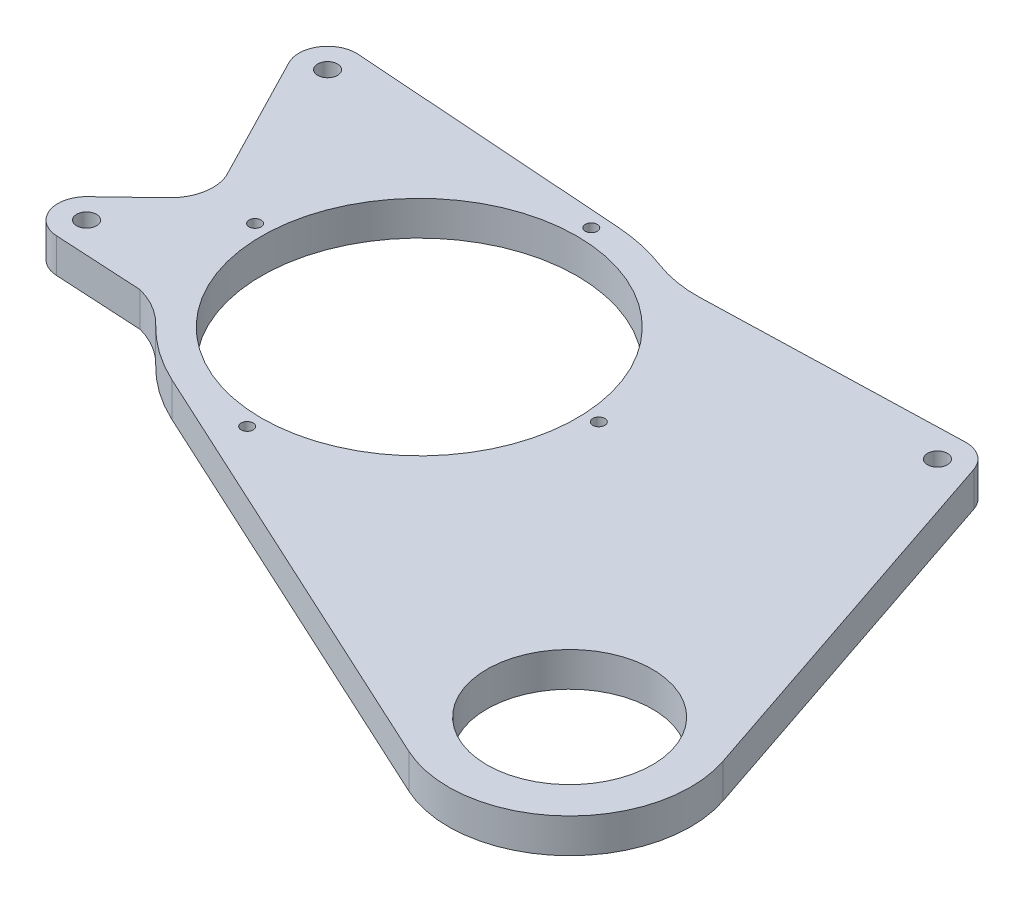
ISO-10303-21;
HEADER;
FILE_DESCRIPTION(('STEP AP214'),'2;1');
FILE_NAME('part.step','',(''),(''),'','','');
FILE_SCHEMA(('AUTOMOTIVE_DESIGN { 1 0 10303 214 1 1 1 1 }'));
ENDSEC;
DATA;
#1=APPLICATION_CONTEXT('core data for automotive mechanical design processes');
#2=APPLICATION_PROTOCOL_DEFINITION('international standard','automotive_design',2000,#1);
#3=PRODUCT_CONTEXT('',#1,'mechanical');
#4=PRODUCT('Part','Part','',(#3));
#5=PRODUCT_RELATED_PRODUCT_CATEGORY('part','',(#4));
#6=PRODUCT_DEFINITION_FORMATION('','',#4);
#7=PRODUCT_DEFINITION_CONTEXT('part definition',#1,'design');
#8=PRODUCT_DEFINITION('design','',#6,#7);
#9=PRODUCT_DEFINITION_SHAPE('','',#8);
#10=(LENGTH_UNIT() NAMED_UNIT(*) SI_UNIT(.MILLI.,.METRE.));
#11=(NAMED_UNIT(*) PLANE_ANGLE_UNIT() SI_UNIT($,.RADIAN.));
#12=(NAMED_UNIT(*) SI_UNIT($,.STERADIAN.) SOLID_ANGLE_UNIT());
#13=UNCERTAINTY_MEASURE_WITH_UNIT(LENGTH_MEASURE(1.E-05),#10,'distance_accuracy_value','');
#14=(GEOMETRIC_REPRESENTATION_CONTEXT(3) GLOBAL_UNCERTAINTY_ASSIGNED_CONTEXT((#13)) GLOBAL_UNIT_ASSIGNED_CONTEXT((#10,
#11,#12)) REPRESENTATION_CONTEXT('',''));
#15=CARTESIAN_POINT('',(0.,0.,0.));
#16=DIRECTION('',(0.,0.,1.));
#17=DIRECTION('',(1.,0.,0.));
#18=AXIS2_PLACEMENT_3D('',#15,#16,#17);
#19=CARTESIAN_POINT('',(-438.15,11.43,160.02));
#20=DIRECTION('',(0.,1.,0.));
#21=DIRECTION('',(0.,0.,1.));
#22=AXIS2_PLACEMENT_3D('',#19,#20,#21);
#23=PLANE('',#22);
#24=CARTESIAN_POINT('',(-575.309999999999,11.43,129.971477371938));
#25=DIRECTION('',(0.,1.,0.));
#26=DIRECTION('',(0.,0.,1.));
#27=AXIS2_PLACEMENT_3D('',#24,#25,#26);
#28=CIRCLE('',#27,2.);
#29=CARTESIAN_POINT('',(-575.309999999999,11.43,131.971477371938));
#30=VERTEX_POINT('',#29);
#31=EDGE_CURVE('E373',#30,#30,#28,.T.);
#32=ORIENTED_EDGE('',*,*,#31,.F.);
#33=EDGE_LOOP('',(#32));
#34=FACE_BOUND('',#33,.T.);
#35=CARTESIAN_POINT('',(-518.217546247164,11.43,70.2574523174055));
#36=DIRECTION('',(0.,1.,0.));
#37=DIRECTION('',(0.,0.,1.));
#38=AXIS2_PLACEMENT_3D('',#35,#36,#37);
#39=CIRCLE('',#38,2.);
#40=CARTESIAN_POINT('',(-518.217546247164,11.43,72.2574523174055));
#41=VERTEX_POINT('',#40);
#42=EDGE_CURVE('E385',#41,#41,#39,.T.);
#43=ORIENTED_EDGE('',*,*,#42,.F.);
#44=EDGE_LOOP('',(#43));
#45=FACE_BOUND('',#44,.T.);
#46=CARTESIAN_POINT('',(-661.36723064215,11.43,97.2747621526214));
#47=DIRECTION('',(0.,1.,0.));
#48=DIRECTION('',(0.,0.,1.));
#49=AXIS2_PLACEMENT_3D('',#46,#47,#48);
#50=CIRCLE('',#49,3.29999999999998);
#51=CARTESIAN_POINT('',(-661.36723064215,11.43,100.574762152621));
#52=VERTEX_POINT('',#51);
#53=EDGE_CURVE('E397',#52,#52,#50,.T.);
#54=ORIENTED_EDGE('',*,*,#53,.F.);
#55=EDGE_LOOP('',(#54));
#56=FACE_BOUND('',#55,.T.);
#57=CARTESIAN_POINT('',(-575.310000000001,11.43,15.6714773719377));
#58=DIRECTION('',(0.,1.,0.));
#59=DIRECTION('',(0.,0.,1.));
#60=AXIS2_PLACEMENT_3D('',#57,#58,#59);
#61=CIRCLE('',#60,2.);
#62=CARTESIAN_POINT('',(-575.310000000001,11.43,17.6714773719377));
#63=VERTEX_POINT('',#62);
#64=EDGE_CURVE('E409',#63,#63,#61,.T.);
#65=ORIENTED_EDGE('',*,*,#64,.F.);
#66=EDGE_LOOP('',(#65));
#67=FACE_BOUND('',#66,.T.);
#68=CARTESIAN_POINT('',(-438.15,11.43,160.02));
#69=DIRECTION('',(0.,1.,0.));
#70=DIRECTION('',(0.,0.,1.));
#71=AXIS2_PLACEMENT_3D('',#68,#69,#70);
#72=CIRCLE('',#71,40.259);
#73=CARTESIAN_POINT('',(-455.030211447492,11.43,196.569220819163));
#74=VERTEX_POINT('',#73);
#75=CARTESIAN_POINT('',(-399.995822112168,11.43,147.172985144259));
#76=VERTEX_POINT('',#75);
#77=EDGE_CURVE('E219',#74,#76,#72,.T.);
#78=ORIENTED_EDGE('',*,*,#77,.T.);
#79=DIRECTION('',(-0.319109139713878,0.,-0.947717973318576));
#80=VECTOR('',#79,1.);
#81=CARTESIAN_POINT('',(-399.995822112168,11.43,147.172985144259));
#82=LINE('',#81,#80);
#83=CARTESIAN_POINT('',(-442.257047487843,11.43,21.6619361692704));
#84=VERTEX_POINT('',#83);
#85=EDGE_CURVE('E127',#76,#84,#82,.T.);
#86=ORIENTED_EDGE('',*,*,#85,.T.);
#87=CARTESIAN_POINT('',(-451.284061183703,11.43,24.701450725045));
#88=DIRECTION('',(0.,1.,0.));
#89=DIRECTION('',(0.,0.,-1.));
#90=AXIS2_PLACEMENT_3D('',#87,#88,#89);
#91=CIRCLE('',#90,9.52499999999995);
#92=CARTESIAN_POINT('',(-451.561292182367,11.43,15.1804860694348));
#93=VERTEX_POINT('',#92);
#94=EDGE_CURVE('E258',#84,#93,#91,.T.);
#95=ORIENTED_EDGE('',*,*,#94,.T.);
#96=DIRECTION('',(-0.999576341796351,0.,0.0291056166577078));
#97=VECTOR('',#96,1.);
#98=CARTESIAN_POINT('',(-451.561292182367,11.43,15.1804860694348));
#99=LINE('',#98,#97);
#100=CARTESIAN_POINT('',(-537.109590398568,11.43,17.6714773719353));
#101=VERTEX_POINT('',#100);
#102=EDGE_CURVE('E277',#93,#101,#99,.T.);
#103=ORIENTED_EDGE('',*,*,#102,.T.);
#104=CARTESIAN_POINT('',(-538.36669905479,11.43,-24.4185739672033));
#105=DIRECTION('',(0.,-1.,0.));
#106=DIRECTION('',(0.,0.,-1.));
#107=AXIS2_PLACEMENT_3D('',#104,#105,#106);
#108=CIRCLE('',#107,42.1088202625635);
#109=CARTESIAN_POINT('',(-553.32169881331,11.43,14.9451241076412));
#110=VERTEX_POINT('',#109);
#111=EDGE_CURVE('E274',#101,#110,#108,.T.);
#112=ORIENTED_EDGE('',*,*,#111,.T.);
#113=CARTESIAN_POINT('',(-575.31,11.43,72.8214773719359));
#114=DIRECTION('',(0.,1.,0.));
#115=DIRECTION('',(0.,0.,-1.));
#116=AXIS2_PLACEMENT_3D('',#113,#114,#115);
#117=CIRCLE('',#116,61.9125);
#118=CARTESIAN_POINT('',(-570.934950003382,11.43,11.0637523994509));
#119=VERTEX_POINT('',#118);
#120=EDGE_CURVE('E276',#110,#119,#117,.T.);
#121=ORIENTED_EDGE('',*,*,#120,.T.);
#122=DIRECTION('',(-0.997500100504502,0.,-0.0706650514293185));
#123=VECTOR('',#122,1.);
#124=CARTESIAN_POINT('',(-663.918846706779,11.43,4.47657327102698));
#125=LINE('',#124,#123);
#126=CARTESIAN_POINT('',(-663.918846706779,11.43,4.4765732710271));
#127=VERTEX_POINT('',#126);
#128=EDGE_CURVE('E279',#119,#127,#125,.T.);
#129=ORIENTED_EDGE('',*,*,#128,.T.);
#130=CARTESIAN_POINT('',(-664.591931321642,11.43,13.9777617283334));
#131=DIRECTION('',(0.,1.,0.));
#132=DIRECTION('',(0.,0.,-1.));
#133=AXIS2_PLACEMENT_3D('',#130,#131,#132);
#134=CIRCLE('',#133,9.52500000000082);
#135=CARTESIAN_POINT('',(-673.057822329129,11.43,18.342886520291));
#136=VERTEX_POINT('',#135);
#137=EDGE_CURVE('E285',#127,#136,#134,.T.);
#138=ORIENTED_EDGE('',*,*,#137,.T.);
#139=DIRECTION('',(0.458280818053406,0.,0.888807454854144));
#140=VECTOR('',#139,1.);
#141=CARTESIAN_POINT('',(-673.057822329129,11.43,18.342886520291));
#142=LINE('',#141,#140);
#143=CARTESIAN_POINT('',(-650.805846426374,11.43,61.499224923482));
#144=VERTEX_POINT('',#143);
#145=EDGE_CURVE('E287',#136,#144,#142,.T.);
#146=ORIENTED_EDGE('',*,*,#145,.T.);
#147=CARTESIAN_POINT('',(-663.980843162533,11.43,66.9216951783142));
#148=DIRECTION('',(0.,-1.,0.));
#149=DIRECTION('',(0.,0.,1.));
#150=AXIS2_PLACEMENT_3D('',#147,#148,#149);
#151=CIRCLE('',#150,14.2472356147552);
#152=CARTESIAN_POINT('',(-654.343117313033,11.43,77.414452828819));
#153=VERTEX_POINT('',#152);
#154=EDGE_CURVE('E289',#144,#153,#151,.T.);
#155=ORIENTED_EDGE('',*,*,#154,.T.);
#156=DIRECTION('',(-0.723683033195204,0.,0.690132499934172));
#157=VECTOR('',#156,1.);
#158=CARTESIAN_POINT('',(-667.940742704022,11.43,90.3816812614368));
#159=LINE('',#158,#157);
#160=CARTESIAN_POINT('',(-667.940742704022,11.43,90.3816812614368));
#161=VERTEX_POINT('',#160);
#162=EDGE_CURVE('E291',#153,#161,#159,.T.);
#163=ORIENTED_EDGE('',*,*,#162,.T.);
#164=CARTESIAN_POINT('',(-661.36723064215,11.43,97.2747621526215));
#165=DIRECTION('',(0.,1.,0.));
#166=DIRECTION('',(0.,0.,-1.));
#167=AXIS2_PLACEMENT_3D('',#164,#165,#166);
#168=CIRCLE('',#167,9.52499999999982);
#169=CARTESIAN_POINT('',(-661.891152148689,11.43,106.785342116797));
#170=VERTEX_POINT('',#169);
#171=EDGE_CURVE('E293',#161,#170,#168,.T.);
#172=ORIENTED_EDGE('',*,*,#171,.T.);
#173=DIRECTION('',(0.998486085477792,0.,0.0550048825763214));
#174=VECTOR('',#173,1.);
#175=CARTESIAN_POINT('',(-661.891152148689,11.43,106.785342116797));
#176=LINE('',#175,#174);
#177=CARTESIAN_POINT('',(-632.402453752836,11.43,108.409823835855));
#178=VERTEX_POINT('',#177);
#179=EDGE_CURVE('E170',#170,#178,#176,.T.);
#180=ORIENTED_EDGE('',*,*,#179,.T.);
#181=CARTESIAN_POINT('',(-639.586583052817,11.43,134.901882673458));
#182=DIRECTION('',(0.,-1.,0.));
#183=DIRECTION('',(0.,0.,-1.));
#184=AXIS2_PLACEMENT_3D('',#181,#182,#183);
#185=CIRCLE('',#184,27.4488778505399);
#186=CARTESIAN_POINT('',(-619.842929594186,11.43,115.832822828795));
#187=VERTEX_POINT('',#186);
#188=EDGE_CURVE('E164',#178,#187,#185,.T.);
#189=ORIENTED_EDGE('',*,*,#188,.T.);
#190=CARTESIAN_POINT('',(-575.31,11.43,72.8214773719359));
#191=DIRECTION('',(0.,1.,0.));
#192=DIRECTION('',(0.,0.,1.));
#193=AXIS2_PLACEMENT_3D('',#190,#191,#192);
#194=CIRCLE('',#193,61.9125);
#195=CARTESIAN_POINT('',(-601.269315711836,11.43,129.028875319388));
#196=VERTEX_POINT('',#195);
#197=EDGE_CURVE('E168',#187,#196,#194,.T.);
#198=ORIENTED_EDGE('',*,*,#197,.T.);
#199=DIRECTION('',(0.90785217762894,0.,0.419290380970505));
#200=VECTOR('',#199,1.);
#201=CARTESIAN_POINT('',(-455.030211447492,11.43,196.569220819163));
#202=LINE('',#201,#200);
#203=EDGE_CURVE('E60',#196,#74,#202,.T.);
#204=ORIENTED_EDGE('',*,*,#203,.T.);
#205=EDGE_LOOP('',(#78,#86,#95,#103,#112,#121,#129,#138,#146,#155,#163,#172,#180,#189,#198,#204));
#206=FACE_BOUND('',#205,.T.);
#207=CARTESIAN_POINT('',(-438.15,11.43,160.02));
#208=DIRECTION('',(0.,1.,0.));
#209=DIRECTION('',(0.,0.,1.));
#210=AXIS2_PLACEMENT_3D('',#207,#208,#209);
#211=CIRCLE('',#210,27.5);
#212=CARTESIAN_POINT('',(-438.15,11.43,187.52));
#213=VERTEX_POINT('',#212);
#214=EDGE_CURVE('E192',#213,#213,#211,.T.);
#215=ORIENTED_EDGE('',*,*,#214,.F.);
#216=EDGE_LOOP('',(#215));
#217=FACE_BOUND('',#216,.T.);
#218=CARTESIAN_POINT('',(-664.591931321643,11.43,13.9777617283329));
#219=DIRECTION('',(0.,1.,0.));
#220=DIRECTION('',(0.,0.,1.));
#221=AXIS2_PLACEMENT_3D('',#218,#219,#220);
#222=CIRCLE('',#221,3.29999999999998);
#223=CARTESIAN_POINT('',(-664.591931321643,11.43,17.2777617283329));
#224=VERTEX_POINT('',#223);
#225=EDGE_CURVE('E403',#224,#224,#222,.T.);
#226=ORIENTED_EDGE('',*,*,#225,.F.);
#227=EDGE_LOOP('',(#226));
#228=FACE_BOUND('',#227,.T.);
#229=CARTESIAN_POINT('',(-451.284061183703,11.43,24.701450725045));
#230=DIRECTION('',(0.,1.,0.));
#231=DIRECTION('',(0.,0.,1.));
#232=AXIS2_PLACEMENT_3D('',#229,#230,#231);
#233=CIRCLE('',#232,3.30000000000003);
#234=CARTESIAN_POINT('',(-451.284061183703,11.43,28.0014507250451));
#235=VERTEX_POINT('',#234);
#236=EDGE_CURVE('E391',#235,#235,#233,.T.);
#237=ORIENTED_EDGE('',*,*,#236,.F.);
#238=EDGE_LOOP('',(#237));
#239=FACE_BOUND('',#238,.T.);
#240=CARTESIAN_POINT('',(-575.31,11.43,72.8214773719376));
#241=DIRECTION('',(0.,1.,0.));
#242=DIRECTION('',(0.,0.,1.));
#243=AXIS2_PLACEMENT_3D('',#240,#241,#242);
#244=CIRCLE('',#243,52.3875);
#245=CARTESIAN_POINT('',(-575.31,11.43,125.208977371938));
#246=VERTEX_POINT('',#245);
#247=EDGE_CURVE('E379',#246,#246,#244,.T.);
#248=ORIENTED_EDGE('',*,*,#247,.F.);
#249=EDGE_LOOP('',(#248));
#250=FACE_BOUND('',#249,.T.);
#251=CARTESIAN_POINT('',(-632.402453752836,11.43,70.2574523174064));
#252=DIRECTION('',(0.,1.,0.));
#253=DIRECTION('',(0.,0.,1.));
#254=AXIS2_PLACEMENT_3D('',#251,#252,#253);
#255=CIRCLE('',#254,2.);
#256=CARTESIAN_POINT('',(-632.402453752836,11.43,72.2574523174064));
#257=VERTEX_POINT('',#256);
#258=EDGE_CURVE('E364',#257,#257,#255,.T.);
#259=ORIENTED_EDGE('',*,*,#258,.F.);
#260=EDGE_LOOP('',(#259));
#261=FACE_BOUND('',#260,.T.);
#262=ADVANCED_FACE('F43',(#34,#45,#56,#67,#206,#217,#228,#239,#250,#261),#23,.T.);
#263=CARTESIAN_POINT('',(-438.15,0.,160.02));
#264=DIRECTION('',(0.,1.,0.));
#265=DIRECTION('',(0.,0.,1.));
#266=AXIS2_PLACEMENT_3D('',#263,#264,#265);
#267=PLANE('',#266);
#268=CARTESIAN_POINT('',(-438.15,0.,160.02));
#269=DIRECTION('',(0.,1.,0.));
#270=DIRECTION('',(0.,0.,1.));
#271=AXIS2_PLACEMENT_3D('',#268,#269,#270);
#272=CIRCLE('',#271,40.259);
#273=CARTESIAN_POINT('',(-455.030211447492,0.,196.569220819163));
#274=VERTEX_POINT('',#273);
#275=CARTESIAN_POINT('',(-399.995822112168,0.,147.172985144259));
#276=VERTEX_POINT('',#275);
#277=EDGE_CURVE('E188',#274,#276,#272,.T.);
#278=ORIENTED_EDGE('',*,*,#277,.F.);
#279=DIRECTION('',(0.90785217762894,0.,0.419290380970505));
#280=VECTOR('',#279,1.);
#281=CARTESIAN_POINT('',(-455.030211447492,0.,196.569220819163));
#282=LINE('',#281,#280);
#283=CARTESIAN_POINT('',(-601.269315711836,0.,129.028875319388));
#284=VERTEX_POINT('',#283);
#285=EDGE_CURVE('E119',#284,#274,#282,.T.);
#286=ORIENTED_EDGE('',*,*,#285,.F.);
#287=CARTESIAN_POINT('',(-575.31,0.,72.8214773719359));
#288=DIRECTION('',(0.,1.,0.));
#289=DIRECTION('',(0.,0.,1.));
#290=AXIS2_PLACEMENT_3D('',#287,#288,#289);
#291=CIRCLE('',#290,61.9125);
#292=CARTESIAN_POINT('',(-619.842929594186,0.,115.832822828795));
#293=VERTEX_POINT('',#292);
#294=EDGE_CURVE('E113',#293,#284,#291,.T.);
#295=ORIENTED_EDGE('',*,*,#294,.F.);
#296=CARTESIAN_POINT('',(-639.586583052817,0.,134.901882673458));
#297=DIRECTION('',(0.,-1.,0.));
#298=DIRECTION('',(0.,0.,-1.));
#299=AXIS2_PLACEMENT_3D('',#296,#297,#298);
#300=CIRCLE('',#299,27.4488778505399);
#301=CARTESIAN_POINT('',(-632.402453752836,0.,108.409823835855));
#302=VERTEX_POINT('',#301);
#303=EDGE_CURVE('E178',#302,#293,#300,.T.);
#304=ORIENTED_EDGE('',*,*,#303,.F.);
#305=DIRECTION('',(0.998486085477792,0.,0.0550048825763214));
#306=VECTOR('',#305,1.);
#307=CARTESIAN_POINT('',(-661.891152148689,0.,106.785342116797));
#308=LINE('',#307,#306);
#309=CARTESIAN_POINT('',(-661.891152148689,0.,106.785342116797));
#310=VERTEX_POINT('',#309);
#311=EDGE_CURVE('E214',#310,#302,#308,.T.);
#312=ORIENTED_EDGE('',*,*,#311,.F.);
#313=CARTESIAN_POINT('',(-661.36723064215,0.,97.2747621526215));
#314=DIRECTION('',(0.,1.,0.));
#315=DIRECTION('',(0.,0.,-1.));
#316=AXIS2_PLACEMENT_3D('',#313,#314,#315);
#317=CIRCLE('',#316,9.52499999999982);
#318=CARTESIAN_POINT('',(-667.940742704022,0.,90.3816812614368));
#319=VERTEX_POINT('',#318);
#320=EDGE_CURVE('E212',#319,#310,#317,.T.);
#321=ORIENTED_EDGE('',*,*,#320,.F.);
#322=DIRECTION('',(-0.723683033195204,0.,0.690132499934172));
#323=VECTOR('',#322,1.);
#324=CARTESIAN_POINT('',(-667.940742704022,0.,90.3816812614368));
#325=LINE('',#324,#323);
#326=CARTESIAN_POINT('',(-654.343117313033,0.,77.414452828819));
#327=VERTEX_POINT('',#326);
#328=EDGE_CURVE('E210',#327,#319,#325,.T.);
#329=ORIENTED_EDGE('',*,*,#328,.F.);
#330=CARTESIAN_POINT('',(-663.980843162533,0.,66.9216951783142));
#331=DIRECTION('',(0.,-1.,0.));
#332=DIRECTION('',(0.,0.,1.));
#333=AXIS2_PLACEMENT_3D('',#330,#331,#332);
#334=CIRCLE('',#333,14.2472356147552);
#335=CARTESIAN_POINT('',(-650.805846426374,0.,61.499224923482));
#336=VERTEX_POINT('',#335);
#337=EDGE_CURVE('E208',#336,#327,#334,.T.);
#338=ORIENTED_EDGE('',*,*,#337,.F.);
#339=DIRECTION('',(0.458280818053406,0.,0.888807454854144));
#340=VECTOR('',#339,1.);
#341=CARTESIAN_POINT('',(-673.057822329129,0.,18.342886520291));
#342=LINE('',#341,#340);
#343=CARTESIAN_POINT('',(-673.057822329129,0.,18.342886520291));
#344=VERTEX_POINT('',#343);
#345=EDGE_CURVE('E206',#344,#336,#342,.T.);
#346=ORIENTED_EDGE('',*,*,#345,.F.);
#347=CARTESIAN_POINT('',(-664.591931321642,0.,13.9777617283334));
#348=DIRECTION('',(0.,1.,0.));
#349=DIRECTION('',(0.,0.,-1.));
#350=AXIS2_PLACEMENT_3D('',#347,#348,#349);
#351=CIRCLE('',#350,9.52500000000082);
#352=CARTESIAN_POINT('',(-663.918846706779,0.,4.4765732710271));
#353=VERTEX_POINT('',#352);
#354=EDGE_CURVE('E204',#353,#344,#351,.T.);
#355=ORIENTED_EDGE('',*,*,#354,.F.);
#356=DIRECTION('',(-0.997500100504502,0.,-0.0706650514293185));
#357=VECTOR('',#356,1.);
#358=CARTESIAN_POINT('',(-663.918846706779,0.,4.47657327102698));
#359=LINE('',#358,#357);
#360=CARTESIAN_POINT('',(-570.934950003382,0.,11.0637523994509));
#361=VERTEX_POINT('',#360);
#362=EDGE_CURVE('E202',#361,#353,#359,.T.);
#363=ORIENTED_EDGE('',*,*,#362,.F.);
#364=CARTESIAN_POINT('',(-575.31,0.,72.8214773719359));
#365=DIRECTION('',(0.,1.,0.));
#366=DIRECTION('',(0.,0.,-1.));
#367=AXIS2_PLACEMENT_3D('',#364,#365,#366);
#368=CIRCLE('',#367,61.9125);
#369=CARTESIAN_POINT('',(-553.32169881331,0.,14.9451241076412));
#370=VERTEX_POINT('',#369);
#371=EDGE_CURVE('E200',#370,#361,#368,.T.);
#372=ORIENTED_EDGE('',*,*,#371,.F.);
#373=CARTESIAN_POINT('',(-538.36669905479,0.,-24.4185739672033));
#374=DIRECTION('',(0.,-1.,0.));
#375=DIRECTION('',(0.,0.,-1.));
#376=AXIS2_PLACEMENT_3D('',#373,#374,#375);
#377=CIRCLE('',#376,42.1088202625635);
#378=CARTESIAN_POINT('',(-537.109590398568,0.,17.6714773719353));
#379=VERTEX_POINT('',#378);
#380=EDGE_CURVE('E198',#379,#370,#377,.T.);
#381=ORIENTED_EDGE('',*,*,#380,.F.);
#382=DIRECTION('',(-0.999576341796351,0.,0.0291056166577078));
#383=VECTOR('',#382,1.);
#384=CARTESIAN_POINT('',(-451.561292182367,0.,15.1804860694348));
#385=LINE('',#384,#383);
#386=CARTESIAN_POINT('',(-451.561292182367,0.,15.1804860694348));
#387=VERTEX_POINT('',#386);
#388=EDGE_CURVE('E196',#387,#379,#385,.T.);
#389=ORIENTED_EDGE('',*,*,#388,.F.);
#390=CARTESIAN_POINT('',(-451.284061183703,0.,24.701450725045));
#391=DIRECTION('',(0.,1.,0.));
#392=DIRECTION('',(0.,0.,-1.));
#393=AXIS2_PLACEMENT_3D('',#390,#391,#392);
#394=CIRCLE('',#393,9.52499999999995);
#395=CARTESIAN_POINT('',(-442.257047487843,0.,21.6619361692704));
#396=VERTEX_POINT('',#395);
#397=EDGE_CURVE('E194',#396,#387,#394,.T.);
#398=ORIENTED_EDGE('',*,*,#397,.F.);
#399=DIRECTION('',(-0.319109139713878,0.,-0.947717973318576));
#400=VECTOR('',#399,1.);
#401=CARTESIAN_POINT('',(-399.995822112168,0.,147.172985144259));
#402=LINE('',#401,#400);
#403=EDGE_CURVE('E191',#276,#396,#402,.T.);
#404=ORIENTED_EDGE('',*,*,#403,.F.);
#405=EDGE_LOOP('',(#278,#286,#295,#304,#312,#321,#329,#338,#346,#355,#363,#372,#381,#389,#398,#404));
#406=FACE_BOUND('',#405,.T.);
#407=CARTESIAN_POINT('',(-438.15,0.,160.02));
#408=DIRECTION('',(0.,1.,0.));
#409=DIRECTION('',(0.,0.,1.));
#410=AXIS2_PLACEMENT_3D('',#407,#408,#409);
#411=CIRCLE('',#410,27.5);
#412=CARTESIAN_POINT('',(-438.15,0.,187.52));
#413=VERTEX_POINT('',#412);
#414=EDGE_CURVE('E412',#413,#413,#411,.T.);
#415=ORIENTED_EDGE('',*,*,#414,.T.);
#416=EDGE_LOOP('',(#415));
#417=FACE_BOUND('',#416,.T.);
#418=CARTESIAN_POINT('',(-575.310000000001,0.,15.6714773719377));
#419=DIRECTION('',(0.,1.,0.));
#420=DIRECTION('',(0.,0.,1.));
#421=AXIS2_PLACEMENT_3D('',#418,#419,#420);
#422=CIRCLE('',#421,2.);
#423=CARTESIAN_POINT('',(-575.310000000001,0.,17.6714773719377));
#424=VERTEX_POINT('',#423);
#425=EDGE_CURVE('E406',#424,#424,#422,.T.);
#426=ORIENTED_EDGE('',*,*,#425,.T.);
#427=EDGE_LOOP('',(#426));
#428=FACE_BOUND('',#427,.T.);
#429=CARTESIAN_POINT('',(-664.591931321643,0.,13.9777617283329));
#430=DIRECTION('',(0.,1.,0.));
#431=DIRECTION('',(0.,0.,1.));
#432=AXIS2_PLACEMENT_3D('',#429,#430,#431);
#433=CIRCLE('',#432,3.29999999999998);
#434=CARTESIAN_POINT('',(-664.591931321643,0.,17.2777617283329));
#435=VERTEX_POINT('',#434);
#436=EDGE_CURVE('E400',#435,#435,#433,.T.);
#437=ORIENTED_EDGE('',*,*,#436,.T.);
#438=EDGE_LOOP('',(#437));
#439=FACE_BOUND('',#438,.T.);
#440=CARTESIAN_POINT('',(-661.36723064215,0.,97.2747621526214));
#441=DIRECTION('',(0.,1.,0.));
#442=DIRECTION('',(0.,0.,1.));
#443=AXIS2_PLACEMENT_3D('',#440,#441,#442);
#444=CIRCLE('',#443,3.29999999999998);
#445=CARTESIAN_POINT('',(-661.36723064215,0.,100.574762152621));
#446=VERTEX_POINT('',#445);
#447=EDGE_CURVE('E394',#446,#446,#444,.T.);
#448=ORIENTED_EDGE('',*,*,#447,.T.);
#449=EDGE_LOOP('',(#448));
#450=FACE_BOUND('',#449,.T.);
#451=CARTESIAN_POINT('',(-451.284061183703,0.,24.701450725045));
#452=DIRECTION('',(0.,1.,0.));
#453=DIRECTION('',(0.,0.,1.));
#454=AXIS2_PLACEMENT_3D('',#451,#452,#453);
#455=CIRCLE('',#454,3.30000000000003);
#456=CARTESIAN_POINT('',(-451.284061183703,0.,28.0014507250451));
#457=VERTEX_POINT('',#456);
#458=EDGE_CURVE('E388',#457,#457,#455,.T.);
#459=ORIENTED_EDGE('',*,*,#458,.T.);
#460=EDGE_LOOP('',(#459));
#461=FACE_BOUND('',#460,.T.);
#462=CARTESIAN_POINT('',(-518.217546247164,0.,70.2574523174055));
#463=DIRECTION('',(0.,1.,0.));
#464=DIRECTION('',(0.,0.,1.));
#465=AXIS2_PLACEMENT_3D('',#462,#463,#464);
#466=CIRCLE('',#465,2.);
#467=CARTESIAN_POINT('',(-518.217546247164,0.,72.2574523174055));
#468=VERTEX_POINT('',#467);
#469=EDGE_CURVE('E382',#468,#468,#466,.T.);
#470=ORIENTED_EDGE('',*,*,#469,.T.);
#471=EDGE_LOOP('',(#470));
#472=FACE_BOUND('',#471,.T.);
#473=CARTESIAN_POINT('',(-575.31,0.,72.8214773719376));
#474=DIRECTION('',(0.,1.,0.));
#475=DIRECTION('',(0.,0.,1.));
#476=AXIS2_PLACEMENT_3D('',#473,#474,#475);
#477=CIRCLE('',#476,52.3875);
#478=CARTESIAN_POINT('',(-575.31,0.,125.208977371938));
#479=VERTEX_POINT('',#478);
#480=EDGE_CURVE('E376',#479,#479,#477,.T.);
#481=ORIENTED_EDGE('',*,*,#480,.T.);
#482=EDGE_LOOP('',(#481));
#483=FACE_BOUND('',#482,.T.);
#484=CARTESIAN_POINT('',(-575.309999999999,0.,129.971477371938));
#485=DIRECTION('',(0.,1.,0.));
#486=DIRECTION('',(0.,0.,1.));
#487=AXIS2_PLACEMENT_3D('',#484,#485,#486);
#488=CIRCLE('',#487,2.);
#489=CARTESIAN_POINT('',(-575.309999999999,0.,131.971477371938));
#490=VERTEX_POINT('',#489);
#491=EDGE_CURVE('E370',#490,#490,#488,.T.);
#492=ORIENTED_EDGE('',*,*,#491,.T.);
#493=EDGE_LOOP('',(#492));
#494=FACE_BOUND('',#493,.T.);
#495=CARTESIAN_POINT('',(-632.402453752836,0.,70.2574523174064));
#496=DIRECTION('',(0.,1.,0.));
#497=DIRECTION('',(0.,0.,1.));
#498=AXIS2_PLACEMENT_3D('',#495,#496,#497);
#499=CIRCLE('',#498,2.);
#500=CARTESIAN_POINT('',(-632.402453752836,0.,72.2574523174064));
#501=VERTEX_POINT('',#500);
#502=EDGE_CURVE('E367',#501,#501,#499,.T.);
#503=ORIENTED_EDGE('',*,*,#502,.T.);
#504=EDGE_LOOP('',(#503));
#505=FACE_BOUND('',#504,.T.);
#506=ADVANCED_FACE('F262',(#406,#417,#428,#439,#450,#461,#472,#483,#494,#505),#267,.F.);
#507=CARTESIAN_POINT('',(-438.15,11.43,160.02));
#508=DIRECTION('',(0.,-1.,0.));
#509=DIRECTION('',(0.,0.,-1.));
#510=AXIS2_PLACEMENT_3D('',#507,#508,#509);
#511=CYLINDRICAL_SURFACE('',#510,40.259);
#512=ORIENTED_EDGE('',*,*,#277,.T.);
#513=DIRECTION('',(0.,-1.,0.));
#514=VECTOR('',#513,1.);
#515=CARTESIAN_POINT('',(-399.995822112168,11.43,147.172985144259));
#516=LINE('',#515,#514);
#517=EDGE_CURVE('E11',#76,#276,#516,.T.);
#518=ORIENTED_EDGE('',*,*,#517,.F.);
#519=ORIENTED_EDGE('',*,*,#77,.F.);
#520=DIRECTION('',(0.,-1.,0.));
#521=VECTOR('',#520,1.);
#522=CARTESIAN_POINT('',(-455.030211447492,11.43,196.569220819163));
#523=LINE('',#522,#521);
#524=EDGE_CURVE('E184',#74,#274,#523,.T.);
#525=ORIENTED_EDGE('',*,*,#524,.T.);
#526=EDGE_LOOP('',(#512,#518,#519,#525));
#527=FACE_BOUND('',#526,.T.);
#528=ADVANCED_FACE('F45',(#527),#511,.T.);
#529=CARTESIAN_POINT('',(-399.995822112168,11.43,147.172985144259));
#530=DIRECTION('',(-0.947717973318576,0.,0.319109139713878));
#531=DIRECTION('',(0.319109139713878,0.,0.947717973318576));
#532=AXIS2_PLACEMENT_3D('',#529,#530,#531);
#533=PLANE('',#532);
#534=ORIENTED_EDGE('',*,*,#403,.T.);
#535=DIRECTION('',(0.,-1.,0.));
#536=VECTOR('',#535,1.);
#537=CARTESIAN_POINT('',(-442.257047487843,11.43,21.6619361692704));
#538=LINE('',#537,#536);
#539=EDGE_CURVE('E52',#84,#396,#538,.T.);
#540=ORIENTED_EDGE('',*,*,#539,.F.);
#541=ORIENTED_EDGE('',*,*,#85,.F.);
#542=ORIENTED_EDGE('',*,*,#517,.T.);
#543=EDGE_LOOP('',(#534,#540,#541,#542));
#544=FACE_BOUND('',#543,.T.);
#545=ADVANCED_FACE('F508',(#544),#533,.F.);
#546=CARTESIAN_POINT('',(-451.284061183703,11.43,24.701450725045));
#547=DIRECTION('',(0.,-1.,0.));
#548=DIRECTION('',(0.,0.,-1.));
#549=AXIS2_PLACEMENT_3D('',#546,#547,#548);
#550=CYLINDRICAL_SURFACE('',#549,9.52499999999995);
#551=ORIENTED_EDGE('',*,*,#397,.T.);
#552=DIRECTION('',(0.,-1.,0.));
#553=VECTOR('',#552,1.);
#554=CARTESIAN_POINT('',(-451.561292182367,11.43,15.1804860694348));
#555=LINE('',#554,#553);
#556=EDGE_CURVE('E250',#93,#387,#555,.T.);
#557=ORIENTED_EDGE('',*,*,#556,.F.);
#558=ORIENTED_EDGE('',*,*,#94,.F.);
#559=ORIENTED_EDGE('',*,*,#539,.T.);
#560=EDGE_LOOP('',(#551,#557,#558,#559));
#561=FACE_BOUND('',#560,.T.);
#562=ADVANCED_FACE('F256',(#561),#550,.T.);
#563=CARTESIAN_POINT('',(-451.561292182367,11.43,15.1804860694348));
#564=DIRECTION('',(0.0291056166577078,0.,0.99957634179635));
#565=DIRECTION('',(0.999576341796351,0.,-0.0291056166577078));
#566=AXIS2_PLACEMENT_3D('',#563,#564,#565);
#567=PLANE('',#566);
#568=ORIENTED_EDGE('',*,*,#388,.T.);
#569=DIRECTION('',(0.,-1.,0.));
#570=VECTOR('',#569,1.);
#571=CARTESIAN_POINT('',(-537.109590398568,11.43,17.6714773719353));
#572=LINE('',#571,#570);
#573=EDGE_CURVE('E247',#101,#379,#572,.T.);
#574=ORIENTED_EDGE('',*,*,#573,.F.);
#575=ORIENTED_EDGE('',*,*,#102,.F.);
#576=ORIENTED_EDGE('',*,*,#556,.T.);
#577=EDGE_LOOP('',(#568,#574,#575,#576));
#578=FACE_BOUND('',#577,.T.);
#579=ADVANCED_FACE('F268',(#578),#567,.F.);
#580=CARTESIAN_POINT('',(-538.36669905479,11.43,-24.4185739672033));
#581=DIRECTION('',(0.,-1.,0.));
#582=DIRECTION('',(0.,0.,-1.));
#583=AXIS2_PLACEMENT_3D('',#580,#581,#582);
#584=CYLINDRICAL_SURFACE('',#583,42.1088202625635);
#585=ORIENTED_EDGE('',*,*,#380,.T.);
#586=DIRECTION('',(0.,-1.,0.));
#587=VECTOR('',#586,1.);
#588=CARTESIAN_POINT('',(-553.32169881331,11.43,14.9451241076412));
#589=LINE('',#588,#587);
#590=EDGE_CURVE('E244',#110,#370,#589,.T.);
#591=ORIENTED_EDGE('',*,*,#590,.F.);
#592=ORIENTED_EDGE('',*,*,#111,.F.);
#593=ORIENTED_EDGE('',*,*,#573,.T.);
#594=EDGE_LOOP('',(#585,#591,#592,#593));
#595=FACE_BOUND('',#594,.T.);
#596=ADVANCED_FACE('F272',(#595),#584,.F.);
#597=CARTESIAN_POINT('',(-575.31,11.43,72.8214773719359));
#598=DIRECTION('',(0.,-1.,0.));
#599=DIRECTION('',(0.,0.,-1.));
#600=AXIS2_PLACEMENT_3D('',#597,#598,#599);
#601=CYLINDRICAL_SURFACE('',#600,61.9125);
#602=ORIENTED_EDGE('',*,*,#371,.T.);
#603=DIRECTION('',(0.,-1.,0.));
#604=VECTOR('',#603,1.);
#605=CARTESIAN_POINT('',(-570.934950003382,11.43,11.0637523994509));
#606=LINE('',#605,#604);
#607=EDGE_CURVE('E241',#119,#361,#606,.T.);
#608=ORIENTED_EDGE('',*,*,#607,.F.);
#609=ORIENTED_EDGE('',*,*,#120,.F.);
#610=ORIENTED_EDGE('',*,*,#590,.T.);
#611=EDGE_LOOP('',(#602,#608,#609,#610));
#612=FACE_BOUND('',#611,.T.);
#613=ADVANCED_FACE('F535',(#612),#601,.T.);
#614=CARTESIAN_POINT('',(-663.918846706779,11.43,4.47657327102698));
#615=DIRECTION('',(-0.0706650514293185,0.,0.997500100504502));
#616=DIRECTION('',(0.997500100504502,0.,0.0706650514293185));
#617=AXIS2_PLACEMENT_3D('',#614,#615,#616);
#618=PLANE('',#617);
#619=ORIENTED_EDGE('',*,*,#362,.T.);
#620=DIRECTION('',(0.,-1.,0.));
#621=VECTOR('',#620,1.);
#622=CARTESIAN_POINT('',(-663.918846706779,11.43,4.4765732710271));
#623=LINE('',#622,#621);
#624=EDGE_CURVE('E238',#127,#353,#623,.T.);
#625=ORIENTED_EDGE('',*,*,#624,.F.);
#626=ORIENTED_EDGE('',*,*,#128,.F.);
#627=ORIENTED_EDGE('',*,*,#607,.T.);
#628=EDGE_LOOP('',(#619,#625,#626,#627));
#629=FACE_BOUND('',#628,.T.);
#630=ADVANCED_FACE('F543',(#629),#618,.F.);
#631=CARTESIAN_POINT('',(-664.591931321642,11.43,13.9777617283334));
#632=DIRECTION('',(0.,-1.,0.));
#633=DIRECTION('',(0.,0.,-1.));
#634=AXIS2_PLACEMENT_3D('',#631,#632,#633);
#635=CYLINDRICAL_SURFACE('',#634,9.52500000000082);
#636=ORIENTED_EDGE('',*,*,#354,.T.);
#637=DIRECTION('',(0.,-1.,0.));
#638=VECTOR('',#637,1.);
#639=CARTESIAN_POINT('',(-673.057822329129,11.43,18.342886520291));
#640=LINE('',#639,#638);
#641=EDGE_CURVE('E235',#136,#344,#640,.T.);
#642=ORIENTED_EDGE('',*,*,#641,.F.);
#643=ORIENTED_EDGE('',*,*,#137,.F.);
#644=ORIENTED_EDGE('',*,*,#624,.T.);
#645=EDGE_LOOP('',(#636,#642,#643,#644));
#646=FACE_BOUND('',#645,.T.);
#647=ADVANCED_FACE('F552',(#646),#635,.T.);
#648=CARTESIAN_POINT('',(-673.057822329129,11.43,18.342886520291));
#649=DIRECTION('',(0.888807454854144,0.,-0.458280818053406));
#650=DIRECTION('',(-0.458280818053406,0.,-0.888807454854144));
#651=AXIS2_PLACEMENT_3D('',#648,#649,#650);
#652=PLANE('',#651);
#653=ORIENTED_EDGE('',*,*,#345,.T.);
#654=DIRECTION('',(0.,-1.,0.));
#655=VECTOR('',#654,1.);
#656=CARTESIAN_POINT('',(-650.805846426374,11.43,61.499224923482));
#657=LINE('',#656,#655);
#658=EDGE_CURVE('E232',#144,#336,#657,.T.);
#659=ORIENTED_EDGE('',*,*,#658,.F.);
#660=ORIENTED_EDGE('',*,*,#145,.F.);
#661=ORIENTED_EDGE('',*,*,#641,.T.);
#662=EDGE_LOOP('',(#653,#659,#660,#661));
#663=FACE_BOUND('',#662,.T.);
#664=ADVANCED_FACE('F561',(#663),#652,.F.);
#665=CARTESIAN_POINT('',(-663.980843162533,11.43,66.9216951783142));
#666=DIRECTION('',(0.,-1.,0.));
#667=DIRECTION('',(0.,0.,-1.));
#668=AXIS2_PLACEMENT_3D('',#665,#666,#667);
#669=CYLINDRICAL_SURFACE('',#668,14.2472356147552);
#670=ORIENTED_EDGE('',*,*,#337,.T.);
#671=DIRECTION('',(0.,-1.,0.));
#672=VECTOR('',#671,1.);
#673=CARTESIAN_POINT('',(-654.343117313033,11.43,77.414452828819));
#674=LINE('',#673,#672);
#675=EDGE_CURVE('E229',#153,#327,#674,.T.);
#676=ORIENTED_EDGE('',*,*,#675,.F.);
#677=ORIENTED_EDGE('',*,*,#154,.F.);
#678=ORIENTED_EDGE('',*,*,#658,.T.);
#679=EDGE_LOOP('',(#670,#676,#677,#678));
#680=FACE_BOUND('',#679,.T.);
#681=ADVANCED_FACE('F570',(#680),#669,.F.);
#682=CARTESIAN_POINT('',(-667.940742704022,11.43,90.3816812614368));
#683=DIRECTION('',(0.690132499934172,0.,0.723683033195204));
#684=DIRECTION('',(0.723683033195204,0.,-0.690132499934172));
#685=AXIS2_PLACEMENT_3D('',#682,#683,#684);
#686=PLANE('',#685);
#687=ORIENTED_EDGE('',*,*,#328,.T.);
#688=DIRECTION('',(0.,-1.,0.));
#689=VECTOR('',#688,1.);
#690=CARTESIAN_POINT('',(-667.940742704022,11.43,90.3816812614368));
#691=LINE('',#690,#689);
#692=EDGE_CURVE('E226',#161,#319,#691,.T.);
#693=ORIENTED_EDGE('',*,*,#692,.F.);
#694=ORIENTED_EDGE('',*,*,#162,.F.);
#695=ORIENTED_EDGE('',*,*,#675,.T.);
#696=EDGE_LOOP('',(#687,#693,#694,#695));
#697=FACE_BOUND('',#696,.T.);
#698=ADVANCED_FACE('F579',(#697),#686,.F.);
#699=CARTESIAN_POINT('',(-661.36723064215,11.43,97.2747621526215));
#700=DIRECTION('',(0.,-1.,0.));
#701=DIRECTION('',(0.,0.,-1.));
#702=AXIS2_PLACEMENT_3D('',#699,#700,#701);
#703=CYLINDRICAL_SURFACE('',#702,9.52499999999982);
#704=ORIENTED_EDGE('',*,*,#320,.T.);
#705=DIRECTION('',(0.,-1.,0.));
#706=VECTOR('',#705,1.);
#707=CARTESIAN_POINT('',(-661.891152148689,11.43,106.785342116797));
#708=LINE('',#707,#706);
#709=EDGE_CURVE('E223',#170,#310,#708,.T.);
#710=ORIENTED_EDGE('',*,*,#709,.F.);
#711=ORIENTED_EDGE('',*,*,#171,.F.);
#712=ORIENTED_EDGE('',*,*,#692,.T.);
#713=EDGE_LOOP('',(#704,#710,#711,#712));
#714=FACE_BOUND('',#713,.T.);
#715=ADVANCED_FACE('F299',(#714),#703,.T.);
#716=CARTESIAN_POINT('',(-661.891152148689,11.43,106.785342116797));
#717=DIRECTION('',(0.0550048825763214,0.,-0.998486085477792));
#718=DIRECTION('',(-0.998486085477792,0.,-0.0550048825763214));
#719=AXIS2_PLACEMENT_3D('',#716,#717,#718);
#720=PLANE('',#719);
#721=ORIENTED_EDGE('',*,*,#311,.T.);
#722=DIRECTION('',(0.,-1.,0.));
#723=VECTOR('',#722,1.);
#724=CARTESIAN_POINT('',(-632.402453752836,11.43,108.409823835855));
#725=LINE('',#724,#723);
#726=EDGE_CURVE('E179',#178,#302,#725,.T.);
#727=ORIENTED_EDGE('',*,*,#726,.F.);
#728=ORIENTED_EDGE('',*,*,#179,.F.);
#729=ORIENTED_EDGE('',*,*,#709,.T.);
#730=EDGE_LOOP('',(#721,#727,#728,#729));
#731=FACE_BOUND('',#730,.T.);
#732=ADVANCED_FACE('F303',(#731),#720,.F.);
#733=CARTESIAN_POINT('',(-639.586583052817,11.43,134.901882673458));
#734=DIRECTION('',(0.,-1.,0.));
#735=DIRECTION('',(0.,0.,-1.));
#736=AXIS2_PLACEMENT_3D('',#733,#734,#735);
#737=CYLINDRICAL_SURFACE('',#736,27.4488778505399);
#738=ORIENTED_EDGE('',*,*,#303,.T.);
#739=DIRECTION('',(0.,-1.,0.));
#740=VECTOR('',#739,1.);
#741=CARTESIAN_POINT('',(-619.842929594186,11.43,115.832822828795));
#742=LINE('',#741,#740);
#743=EDGE_CURVE('E175',#187,#293,#742,.T.);
#744=ORIENTED_EDGE('',*,*,#743,.F.);
#745=ORIENTED_EDGE('',*,*,#188,.F.);
#746=ORIENTED_EDGE('',*,*,#726,.T.);
#747=EDGE_LOOP('',(#738,#744,#745,#746));
#748=FACE_BOUND('',#747,.T.);
#749=ADVANCED_FACE('F176',(#748),#737,.F.);
#750=CARTESIAN_POINT('',(-575.31,11.43,72.8214773719359));
#751=DIRECTION('',(0.,-1.,0.));
#752=DIRECTION('',(0.,0.,-1.));
#753=AXIS2_PLACEMENT_3D('',#750,#751,#752);
#754=CYLINDRICAL_SURFACE('',#753,61.9125);
#755=ORIENTED_EDGE('',*,*,#294,.T.);
#756=DIRECTION('',(0.,-1.,0.));
#757=VECTOR('',#756,1.);
#758=CARTESIAN_POINT('',(-601.269315711836,11.43,129.028875319388));
#759=LINE('',#758,#757);
#760=EDGE_CURVE('E180',#196,#284,#759,.T.);
#761=ORIENTED_EDGE('',*,*,#760,.F.);
#762=ORIENTED_EDGE('',*,*,#197,.F.);
#763=ORIENTED_EDGE('',*,*,#743,.T.);
#764=EDGE_LOOP('',(#755,#761,#762,#763));
#765=FACE_BOUND('',#764,.T.);
#766=ADVANCED_FACE('F182',(#765),#754,.T.);
#767=CARTESIAN_POINT('',(-455.030211447492,11.43,196.569220819163));
#768=DIRECTION('',(0.419290380970505,0.,-0.90785217762894));
#769=DIRECTION('',(-0.90785217762894,0.,-0.419290380970505));
#770=AXIS2_PLACEMENT_3D('',#767,#768,#769);
#771=PLANE('',#770);
#772=ORIENTED_EDGE('',*,*,#285,.T.);
#773=ORIENTED_EDGE('',*,*,#524,.F.);
#774=ORIENTED_EDGE('',*,*,#203,.F.);
#775=ORIENTED_EDGE('',*,*,#760,.T.);
#776=EDGE_LOOP('',(#772,#773,#774,#775));
#777=FACE_BOUND('',#776,.T.);
#778=ADVANCED_FACE('F307',(#777),#771,.F.);
#779=CARTESIAN_POINT('',(-438.15,11.43,160.02));
#780=DIRECTION('',(0.,-1.,0.));
#781=DIRECTION('',(0.,0.,-1.));
#782=AXIS2_PLACEMENT_3D('',#779,#780,#781);
#783=CYLINDRICAL_SURFACE('',#782,27.5);
#784=ORIENTED_EDGE('',*,*,#214,.T.);
#785=EDGE_LOOP('',(#784));
#786=FACE_BOUND('',#785,.T.);
#787=ORIENTED_EDGE('',*,*,#414,.F.);
#788=EDGE_LOOP('',(#787));
#789=FACE_BOUND('',#788,.T.);
#790=ADVANCED_FACE('F309',(#786,#789),#783,.F.);
#791=CARTESIAN_POINT('',(-575.310000000001,11.43,15.6714773719377));
#792=DIRECTION('',(0.,-1.,0.));
#793=DIRECTION('',(0.,0.,-1.));
#794=AXIS2_PLACEMENT_3D('',#791,#792,#793);
#795=CYLINDRICAL_SURFACE('',#794,2.);
#796=ORIENTED_EDGE('',*,*,#425,.F.);
#797=EDGE_LOOP('',(#796));
#798=FACE_BOUND('',#797,.T.);
#799=ORIENTED_EDGE('',*,*,#64,.T.);
#800=EDGE_LOOP('',(#799));
#801=FACE_BOUND('',#800,.T.);
#802=ADVANCED_FACE('F315',(#798,#801),#795,.F.);
#803=CARTESIAN_POINT('',(-664.591931321643,11.43,13.9777617283329));
#804=DIRECTION('',(0.,-1.,0.));
#805=DIRECTION('',(0.,0.,-1.));
#806=AXIS2_PLACEMENT_3D('',#803,#804,#805);
#807=CYLINDRICAL_SURFACE('',#806,3.29999999999998);
#808=ORIENTED_EDGE('',*,*,#225,.T.);
#809=EDGE_LOOP('',(#808));
#810=FACE_BOUND('',#809,.T.);
#811=ORIENTED_EDGE('',*,*,#436,.F.);
#812=EDGE_LOOP('',(#811));
#813=FACE_BOUND('',#812,.T.);
#814=ADVANCED_FACE('F331',(#810,#813),#807,.F.);
#815=CARTESIAN_POINT('',(-661.36723064215,11.43,97.2747621526214));
#816=DIRECTION('',(0.,-1.,0.));
#817=DIRECTION('',(0.,0.,-1.));
#818=AXIS2_PLACEMENT_3D('',#815,#816,#817);
#819=CYLINDRICAL_SURFACE('',#818,3.29999999999998);
#820=ORIENTED_EDGE('',*,*,#53,.T.);
#821=EDGE_LOOP('',(#820));
#822=FACE_BOUND('',#821,.T.);
#823=ORIENTED_EDGE('',*,*,#447,.F.);
#824=EDGE_LOOP('',(#823));
#825=FACE_BOUND('',#824,.T.);
#826=ADVANCED_FACE('F335',(#822,#825),#819,.F.);
#827=CARTESIAN_POINT('',(-451.284061183703,11.43,24.701450725045));
#828=DIRECTION('',(0.,-1.,0.));
#829=DIRECTION('',(0.,0.,-1.));
#830=AXIS2_PLACEMENT_3D('',#827,#828,#829);
#831=CYLINDRICAL_SURFACE('',#830,3.30000000000003);
#832=ORIENTED_EDGE('',*,*,#236,.T.);
#833=EDGE_LOOP('',(#832));
#834=FACE_BOUND('',#833,.T.);
#835=ORIENTED_EDGE('',*,*,#458,.F.);
#836=EDGE_LOOP('',(#835));
#837=FACE_BOUND('',#836,.T.);
#838=ADVANCED_FACE('F339',(#834,#837),#831,.F.);
#839=CARTESIAN_POINT('',(-518.217546247164,11.43,70.2574523174055));
#840=DIRECTION('',(0.,-1.,0.));
#841=DIRECTION('',(0.,0.,-1.));
#842=AXIS2_PLACEMENT_3D('',#839,#840,#841);
#843=CYLINDRICAL_SURFACE('',#842,2.);
#844=ORIENTED_EDGE('',*,*,#469,.F.);
#845=EDGE_LOOP('',(#844));
#846=FACE_BOUND('',#845,.T.);
#847=ORIENTED_EDGE('',*,*,#42,.T.);
#848=EDGE_LOOP('',(#847));
#849=FACE_BOUND('',#848,.T.);
#850=ADVANCED_FACE('F343',(#846,#849),#843,.F.);
#851=CARTESIAN_POINT('',(-575.31,11.43,72.8214773719376));
#852=DIRECTION('',(0.,-1.,0.));
#853=DIRECTION('',(0.,0.,-1.));
#854=AXIS2_PLACEMENT_3D('',#851,#852,#853);
#855=CYLINDRICAL_SURFACE('',#854,52.3875);
#856=ORIENTED_EDGE('',*,*,#247,.T.);
#857=EDGE_LOOP('',(#856));
#858=FACE_BOUND('',#857,.T.);
#859=ORIENTED_EDGE('',*,*,#480,.F.);
#860=EDGE_LOOP('',(#859));
#861=FACE_BOUND('',#860,.T.);
#862=ADVANCED_FACE('F347',(#858,#861),#855,.F.);
#863=CARTESIAN_POINT('',(-575.309999999999,11.43,129.971477371938));
#864=DIRECTION('',(0.,-1.,0.));
#865=DIRECTION('',(0.,0.,-1.));
#866=AXIS2_PLACEMENT_3D('',#863,#864,#865);
#867=CYLINDRICAL_SURFACE('',#866,2.);
#868=ORIENTED_EDGE('',*,*,#491,.F.);
#869=EDGE_LOOP('',(#868));
#870=FACE_BOUND('',#869,.T.);
#871=ORIENTED_EDGE('',*,*,#31,.T.);
#872=EDGE_LOOP('',(#871));
#873=FACE_BOUND('',#872,.T.);
#874=ADVANCED_FACE('F351',(#870,#873),#867,.F.);
#875=CARTESIAN_POINT('',(-632.402453752836,11.43,70.2574523174064));
#876=DIRECTION('',(0.,-1.,0.));
#877=DIRECTION('',(0.,0.,-1.));
#878=AXIS2_PLACEMENT_3D('',#875,#876,#877);
#879=CYLINDRICAL_SURFACE('',#878,2.);
#880=ORIENTED_EDGE('',*,*,#258,.T.);
#881=EDGE_LOOP('',(#880));
#882=FACE_BOUND('',#881,.T.);
#883=ORIENTED_EDGE('',*,*,#502,.F.);
#884=EDGE_LOOP('',(#883));
#885=FACE_BOUND('',#884,.T.);
#886=ADVANCED_FACE('F355',(#882,#885),#879,.F.);
#887=CLOSED_SHELL('',(#262,#506,#528,#545,#562,#579,#596,#613,#630,#647,#664,#681,#698,#715,
#732,#749,#766,#778,#790,#802,#814,#826,#838,#850,#862,#874,#886));
#888=MANIFOLD_SOLID_BREP('B2',#887);
#889=ADVANCED_BREP_SHAPE_REPRESENTATION('',(#18,#888),#14);
#890=SHAPE_DEFINITION_REPRESENTATION(#9,#889);
ENDSEC;
END-ISO-10303-21;
